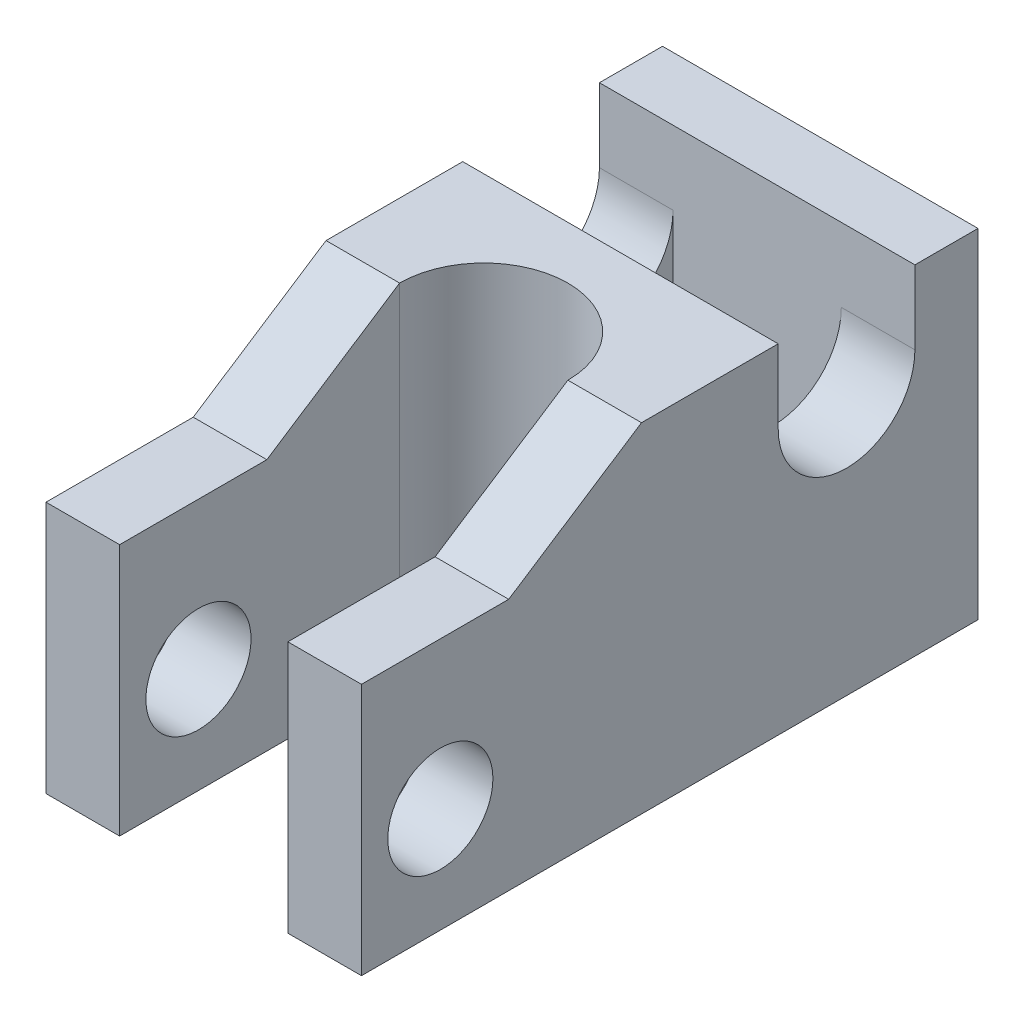
ISO-10303-21;
HEADER;
FILE_DESCRIPTION(('STEP AP214'),'2;1');
FILE_NAME('part.step','',(''),(''),'','','');
FILE_SCHEMA(('AUTOMOTIVE_DESIGN { 1 0 10303 214 1 1 1 1 }'));
ENDSEC;
DATA;
#1=APPLICATION_CONTEXT('core data for automotive mechanical design processes');
#2=APPLICATION_PROTOCOL_DEFINITION('international standard','automotive_design',2000,#1);
#3=PRODUCT_CONTEXT('',#1,'mechanical');
#4=PRODUCT('Part','Part','',(#3));
#5=PRODUCT_RELATED_PRODUCT_CATEGORY('part','',(#4));
#6=PRODUCT_DEFINITION_FORMATION('','',#4);
#7=PRODUCT_DEFINITION_CONTEXT('part definition',#1,'design');
#8=PRODUCT_DEFINITION('design','',#6,#7);
#9=PRODUCT_DEFINITION_SHAPE('','',#8);
#10=(LENGTH_UNIT() NAMED_UNIT(*) SI_UNIT(.MILLI.,.METRE.));
#11=(NAMED_UNIT(*) PLANE_ANGLE_UNIT() SI_UNIT($,.RADIAN.));
#12=(NAMED_UNIT(*) SI_UNIT($,.STERADIAN.) SOLID_ANGLE_UNIT());
#13=UNCERTAINTY_MEASURE_WITH_UNIT(LENGTH_MEASURE(1.E-05),#10,'distance_accuracy_value','');
#14=(GEOMETRIC_REPRESENTATION_CONTEXT(3) GLOBAL_UNCERTAINTY_ASSIGNED_CONTEXT((#13)) GLOBAL_UNIT_ASSIGNED_CONTEXT((#10,
#11,#12)) REPRESENTATION_CONTEXT('',''));
#15=CARTESIAN_POINT('',(0.,0.,0.));
#16=DIRECTION('',(0.,0.,1.));
#17=DIRECTION('',(1.,0.,0.));
#18=AXIS2_PLACEMENT_3D('',#15,#16,#17);
#19=CARTESIAN_POINT('',(0.,0.460908484619424,0.));
#20=DIRECTION('',(0.,1.,0.));
#21=DIRECTION('',(0.,0.,1.));
#22=AXIS2_PLACEMENT_3D('',#19,#20,#21);
#23=PLANE('',#22);
#24=DIRECTION('',(0.,0.,1.));
#25=VECTOR('',#24,1.);
#26=CARTESIAN_POINT('',(-46.,0.460908484619424,0.));
#27=LINE('',#26,#25);
#28=CARTESIAN_POINT('',(-46.,0.460908484619414,-17.8776728376176));
#29=VERTEX_POINT('',#28);
#30=CARTESIAN_POINT('',(-46.,0.460908484619424,8.12232716238245));
#31=VERTEX_POINT('',#30);
#32=EDGE_CURVE('E287',#29,#31,#27,.T.);
#33=ORIENTED_EDGE('',*,*,#32,.F.);
#34=DIRECTION('',(1.,0.,0.));
#35=VECTOR('',#34,1.);
#36=CARTESIAN_POINT('',(0.,0.46090848461941,-17.8776728376176));
#37=LINE('',#36,#35);
#38=CARTESIAN_POINT('',(-14.,0.460908484619414,-17.8776728376176));
#39=VERTEX_POINT('',#38);
#40=EDGE_CURVE('E306',#29,#39,#37,.T.);
#41=ORIENTED_EDGE('',*,*,#40,.T.);
#42=DIRECTION('',(0.,0.,1.));
#43=VECTOR('',#42,1.);
#44=CARTESIAN_POINT('',(-14.,0.460908484619424,0.));
#45=LINE('',#44,#43);
#46=CARTESIAN_POINT('',(-14.,0.460908484619424,8.12232716238245));
#47=VERTEX_POINT('',#46);
#48=EDGE_CURVE('E323',#39,#47,#45,.T.);
#49=ORIENTED_EDGE('',*,*,#48,.T.);
#50=CARTESIAN_POINT('',(-30.,0.460908484619424,8.12232716238245));
#51=DIRECTION('',(0.,1.,0.));
#52=DIRECTION('',(0.,0.,1.));
#53=AXIS2_PLACEMENT_3D('',#50,#51,#52);
#54=CIRCLE('',#53,16.);
#55=EDGE_CURVE('E308',#31,#47,#54,.F.);
#56=ORIENTED_EDGE('',*,*,#55,.F.);
#57=EDGE_LOOP('',(#33,#41,#49,#56));
#58=FACE_BOUND('',#57,.T.);
#59=ADVANCED_FACE('F75',(#58),#23,.F.);
#60=CARTESIAN_POINT('',(-14.,0.,0.));
#61=DIRECTION('',(1.,0.,0.));
#62=DIRECTION('',(0.,0.,-1.));
#63=AXIS2_PLACEMENT_3D('',#60,#61,#62);
#64=PLANE('',#63);
#65=CARTESIAN_POINT('',(-14.,20.,46.3819985638976));
#66=DIRECTION('',(1.,0.,0.));
#67=DIRECTION('',(0.,0.,-1.));
#68=AXIS2_PLACEMENT_3D('',#65,#66,#67);
#69=CIRCLE('',#68,10.);
#70=CARTESIAN_POINT('',(-14.,20.,36.3819985638976));
#71=VERTEX_POINT('',#70);
#72=EDGE_CURVE('E333',#71,#71,#69,.T.);
#73=ORIENTED_EDGE('',*,*,#72,.T.);
#74=EDGE_LOOP('',(#73));
#75=FACE_BOUND('',#74,.T.);
#76=CARTESIAN_POINT('',(-14.,50.4609084846194,-30.8776728376176));
#77=DIRECTION('',(1.,0.,0.));
#78=DIRECTION('',(0.,0.,-1.));
#79=AXIS2_PLACEMENT_3D('',#76,#77,#78);
#80=CIRCLE('',#79,13.);
#81=CARTESIAN_POINT('',(-14.,50.4609084846194,-17.8776728376176));
#82=VERTEX_POINT('',#81);
#83=CARTESIAN_POINT('',(-14.,50.4609084846194,-43.8776728376176));
#84=VERTEX_POINT('',#83);
#85=EDGE_CURVE('E336',#82,#84,#80,.T.);
#86=ORIENTED_EDGE('',*,*,#85,.T.);
#87=DIRECTION('',(0.,-1.,0.));
#88=VECTOR('',#87,1.);
#89=CARTESIAN_POINT('',(-14.,0.,-43.8776728376176));
#90=LINE('',#89,#88);
#91=CARTESIAN_POINT('',(-14.,0.46090848461941,-43.8776728376176));
#92=VERTEX_POINT('',#91);
#93=EDGE_CURVE('E92',#84,#92,#90,.T.);
#94=ORIENTED_EDGE('',*,*,#93,.T.);
#95=DIRECTION('',(0.,0.,-1.));
#96=VECTOR('',#95,1.);
#97=CARTESIAN_POINT('',(-14.,0.46090848461941,0.));
#98=LINE('',#97,#96);
#99=CARTESIAN_POINT('',(-14.,0.46090848461941,-55.8776728376176));
#100=VERTEX_POINT('',#99);
#101=EDGE_CURVE('E96',#92,#100,#98,.T.);
#102=ORIENTED_EDGE('',*,*,#101,.T.);
#103=DIRECTION('',(0.,-1.,0.));
#104=VECTOR('',#103,1.);
#105=CARTESIAN_POINT('',(-14.,0.,-55.8776728376176));
#106=LINE('',#105,#104);
#107=CARTESIAN_POINT('',(-14.,0.,-55.8776728376176));
#108=VERTEX_POINT('',#107);
#109=EDGE_CURVE('E348',#100,#108,#106,.T.);
#110=ORIENTED_EDGE('',*,*,#109,.T.);
#111=DIRECTION('',(0.,0.,-1.));
#112=VECTOR('',#111,1.);
#113=CARTESIAN_POINT('',(-14.,0.,0.));
#114=LINE('',#113,#112);
#115=CARTESIAN_POINT('',(-14.,0.,61.3819985638976));
#116=VERTEX_POINT('',#115);
#117=EDGE_CURVE('E345',#116,#108,#114,.T.);
#118=ORIENTED_EDGE('',*,*,#117,.F.);
#119=DIRECTION('',(0.,1.,0.));
#120=VECTOR('',#119,1.);
#121=CARTESIAN_POINT('',(-14.,0.,61.3819985638976));
#122=LINE('',#121,#120);
#123=CARTESIAN_POINT('',(-14.,48.,61.3819985638976));
#124=VERTEX_POINT('',#123);
#125=EDGE_CURVE('E343',#116,#124,#122,.T.);
#126=ORIENTED_EDGE('',*,*,#125,.T.);
#127=DIRECTION('',(0.,0.,-1.));
#128=VECTOR('',#127,1.);
#129=CARTESIAN_POINT('',(-14.,48.,0.));
#130=LINE('',#129,#128);
#131=CARTESIAN_POINT('',(-14.,48.,33.3819985638976));
#132=VERTEX_POINT('',#131);
#133=EDGE_CURVE('E341',#124,#132,#130,.T.);
#134=ORIENTED_EDGE('',*,*,#133,.T.);
#135=DIRECTION('',(0.,0.545970114749841,-0.837804651335886));
#136=VECTOR('',#135,1.);
#137=CARTESIAN_POINT('',(-14.,48.9614687464449,31.9066009805433));
#138=LINE('',#137,#136);
#139=CARTESIAN_POINT('',(-14.,64.4609084846195,8.12232716238241));
#140=VERTEX_POINT('',#139);
#141=EDGE_CURVE('E339',#132,#140,#138,.T.);
#142=ORIENTED_EDGE('',*,*,#141,.T.);
#143=DIRECTION('',(0.,1.,0.));
#144=VECTOR('',#143,1.);
#145=CARTESIAN_POINT('',(-14.,0.460908484619424,8.12232716238245));
#146=LINE('',#145,#144);
#147=EDGE_CURVE('E320',#47,#140,#146,.T.);
#148=ORIENTED_EDGE('',*,*,#147,.F.);
#149=ORIENTED_EDGE('',*,*,#48,.F.);
#150=DIRECTION('',(0.,-1.,0.));
#151=VECTOR('',#150,1.);
#152=CARTESIAN_POINT('',(-14.,0.,-17.8776728376176));
#153=LINE('',#152,#151);
#154=EDGE_CURVE('E329',#82,#39,#153,.T.);
#155=ORIENTED_EDGE('',*,*,#154,.F.);
#156=EDGE_LOOP('',(#86,#94,#102,#110,#118,#126,#134,#142,#148,#149,#155));
#157=FACE_BOUND('',#156,.T.);
#158=ADVANCED_FACE('F452',(#75,#157),#64,.F.);
#159=CARTESIAN_POINT('',(-14.,50.4609084846194,-30.8776728376176));
#160=DIRECTION('',(1.,0.,0.));
#161=DIRECTION('',(0.,0.,-1.));
#162=AXIS2_PLACEMENT_3D('',#159,#160,#161);
#163=CYLINDRICAL_SURFACE('',#162,13.);
#164=CARTESIAN_POINT('',(0.,50.4609084846194,-30.8776728376176));
#165=DIRECTION('',(1.,0.,0.));
#166=DIRECTION('',(0.,0.,-1.));
#167=AXIS2_PLACEMENT_3D('',#164,#165,#166);
#168=CIRCLE('',#167,13.);
#169=CARTESIAN_POINT('',(0.,50.4609084846194,-17.8776728376176));
#170=VERTEX_POINT('',#169);
#171=CARTESIAN_POINT('',(0.,50.4609084846194,-43.8776728376176));
#172=VERTEX_POINT('',#171);
#173=EDGE_CURVE('E352',#170,#172,#168,.T.);
#174=ORIENTED_EDGE('',*,*,#173,.T.);
#175=DIRECTION('',(1.,0.,0.));
#176=VECTOR('',#175,1.);
#177=CARTESIAN_POINT('',(-14.,50.4609084846194,-43.8776728376176));
#178=LINE('',#177,#176);
#179=EDGE_CURVE('E12',#84,#172,#178,.T.);
#180=ORIENTED_EDGE('',*,*,#179,.F.);
#181=ORIENTED_EDGE('',*,*,#85,.F.);
#182=DIRECTION('',(1.,0.,0.));
#183=VECTOR('',#182,1.);
#184=CARTESIAN_POINT('',(-14.,50.4609084846194,-17.8776728376176));
#185=LINE('',#184,#183);
#186=EDGE_CURVE('E79',#82,#170,#185,.T.);
#187=ORIENTED_EDGE('',*,*,#186,.T.);
#188=EDGE_LOOP('',(#174,#180,#181,#187));
#189=FACE_BOUND('',#188,.T.);
#190=ADVANCED_FACE('F400',(#189),#163,.F.);
#191=CARTESIAN_POINT('',(-14.,0.,-43.8776728376176));
#192=DIRECTION('',(0.,0.,1.));
#193=DIRECTION('',(1.,0.,0.));
#194=AXIS2_PLACEMENT_3D('',#191,#192,#193);
#195=PLANE('',#194);
#196=DIRECTION('',(0.,-1.,0.));
#197=VECTOR('',#196,1.);
#198=CARTESIAN_POINT('',(0.,0.,-43.8776728376176));
#199=LINE('',#198,#197);
#200=CARTESIAN_POINT('',(0.,64.4609084846194,-43.8776728376176));
#201=VERTEX_POINT('',#200);
#202=EDGE_CURVE('E337',#201,#172,#199,.T.);
#203=ORIENTED_EDGE('',*,*,#202,.F.);
#204=DIRECTION('',(1.,0.,0.));
#205=VECTOR('',#204,1.);
#206=CARTESIAN_POINT('',(-14.,64.4609084846194,-43.8776728376176));
#207=LINE('',#206,#205);
#208=CARTESIAN_POINT('',(-60.,64.4609084846194,-43.8776728376176));
#209=VERTEX_POINT('',#208);
#210=EDGE_CURVE('E84',#209,#201,#207,.T.);
#211=ORIENTED_EDGE('',*,*,#210,.F.);
#212=DIRECTION('',(0.,-1.,0.));
#213=VECTOR('',#212,1.);
#214=CARTESIAN_POINT('',(-60.,0.,-43.8776728376176));
#215=LINE('',#214,#213);
#216=CARTESIAN_POINT('',(-60.,50.4609084846194,-43.8776728376176));
#217=VERTEX_POINT('',#216);
#218=EDGE_CURVE('E249',#209,#217,#215,.T.);
#219=ORIENTED_EDGE('',*,*,#218,.T.);
#220=DIRECTION('',(-1.,0.,0.));
#221=VECTOR('',#220,1.);
#222=CARTESIAN_POINT('',(-46.,50.4609084846194,-43.8776728376176));
#223=LINE('',#222,#221);
#224=CARTESIAN_POINT('',(-46.,50.4609084846194,-43.8776728376176));
#225=VERTEX_POINT('',#224);
#226=EDGE_CURVE('E223',#225,#217,#223,.T.);
#227=ORIENTED_EDGE('',*,*,#226,.F.);
#228=DIRECTION('',(0.,1.,0.));
#229=VECTOR('',#228,1.);
#230=CARTESIAN_POINT('',(-46.,0.,-43.8776728376176));
#231=LINE('',#230,#229);
#232=CARTESIAN_POINT('',(-46.,0.46090848461941,-43.8776728376176));
#233=VERTEX_POINT('',#232);
#234=EDGE_CURVE('E217',#233,#225,#231,.T.);
#235=ORIENTED_EDGE('',*,*,#234,.F.);
#236=DIRECTION('',(1.,0.,0.));
#237=VECTOR('',#236,1.);
#238=CARTESIAN_POINT('',(0.,0.46090848461941,-43.8776728376176));
#239=LINE('',#238,#237);
#240=EDGE_CURVE('E221',#233,#92,#239,.T.);
#241=ORIENTED_EDGE('',*,*,#240,.T.);
#242=ORIENTED_EDGE('',*,*,#93,.F.);
#243=ORIENTED_EDGE('',*,*,#179,.T.);
#244=EDGE_LOOP('',(#203,#211,#219,#227,#235,#241,#242,#243));
#245=FACE_BOUND('',#244,.T.);
#246=ADVANCED_FACE('F220',(#245),#195,.T.);
#247=CARTESIAN_POINT('',(-14.,64.4609084846194,0.));
#248=DIRECTION('',(0.,-1.,0.));
#249=DIRECTION('',(0.,0.,-1.));
#250=AXIS2_PLACEMENT_3D('',#247,#248,#249);
#251=PLANE('',#250);
#252=DIRECTION('',(0.,0.,-1.));
#253=VECTOR('',#252,1.);
#254=CARTESIAN_POINT('',(0.,64.4609084846194,0.));
#255=LINE('',#254,#253);
#256=CARTESIAN_POINT('',(0.,64.4609084846194,-55.8776728376176));
#257=VERTEX_POINT('',#256);
#258=EDGE_CURVE('E371',#201,#257,#255,.T.);
#259=ORIENTED_EDGE('',*,*,#258,.T.);
#260=DIRECTION('',(1.,0.,0.));
#261=VECTOR('',#260,1.);
#262=CARTESIAN_POINT('',(-14.,64.4609084846194,-55.8776728376176));
#263=LINE('',#262,#261);
#264=CARTESIAN_POINT('',(-60.,64.4609084846194,-55.8776728376176));
#265=VERTEX_POINT('',#264);
#266=EDGE_CURVE('E376',#265,#257,#263,.T.);
#267=ORIENTED_EDGE('',*,*,#266,.F.);
#268=DIRECTION('',(0.,0.,-1.));
#269=VECTOR('',#268,1.);
#270=CARTESIAN_POINT('',(-60.,64.4609084846194,0.));
#271=LINE('',#270,#269);
#272=EDGE_CURVE('E282',#209,#265,#271,.T.);
#273=ORIENTED_EDGE('',*,*,#272,.F.);
#274=ORIENTED_EDGE('',*,*,#210,.T.);
#275=EDGE_LOOP('',(#259,#267,#273,#274));
#276=FACE_BOUND('',#275,.T.);
#277=ADVANCED_FACE('F412',(#276),#251,.F.);
#278=CARTESIAN_POINT('',(-14.,0.,-55.8776728376176));
#279=DIRECTION('',(0.,0.,1.));
#280=DIRECTION('',(0.,-1.,0.));
#281=AXIS2_PLACEMENT_3D('',#278,#279,#280);
#282=PLANE('',#281);
#283=ORIENTED_EDGE('',*,*,#109,.F.);
#284=DIRECTION('',(-1.,0.,0.));
#285=VECTOR('',#284,1.);
#286=CARTESIAN_POINT('',(-60.,0.46090848461941,-55.8776728376176));
#287=LINE('',#286,#285);
#288=CARTESIAN_POINT('',(-46.,0.46090848461941,-55.8776728376176));
#289=VERTEX_POINT('',#288);
#290=EDGE_CURVE('E233',#100,#289,#287,.T.);
#291=ORIENTED_EDGE('',*,*,#290,.T.);
#292=DIRECTION('',(0.,-1.,0.));
#293=VECTOR('',#292,1.);
#294=CARTESIAN_POINT('',(-46.,0.,-55.8776728376176));
#295=LINE('',#294,#293);
#296=CARTESIAN_POINT('',(-46.,0.,-55.8776728376176));
#297=VERTEX_POINT('',#296);
#298=EDGE_CURVE('E238',#289,#297,#295,.T.);
#299=ORIENTED_EDGE('',*,*,#298,.T.);
#300=DIRECTION('',(-1.,0.,0.));
#301=VECTOR('',#300,1.);
#302=CARTESIAN_POINT('',(-46.,0.,-55.8776728376176));
#303=LINE('',#302,#301);
#304=CARTESIAN_POINT('',(-60.,0.,-55.8776728376176));
#305=VERTEX_POINT('',#304);
#306=EDGE_CURVE('E288',#297,#305,#303,.T.);
#307=ORIENTED_EDGE('',*,*,#306,.T.);
#308=DIRECTION('',(0.,-1.,0.));
#309=VECTOR('',#308,1.);
#310=CARTESIAN_POINT('',(-60.,0.,-55.8776728376176));
#311=LINE('',#310,#309);
#312=EDGE_CURVE('E280',#265,#305,#311,.T.);
#313=ORIENTED_EDGE('',*,*,#312,.F.);
#314=ORIENTED_EDGE('',*,*,#266,.T.);
#315=DIRECTION('',(0.,-1.,0.));
#316=VECTOR('',#315,1.);
#317=CARTESIAN_POINT('',(0.,0.,-55.8776728376176));
#318=LINE('',#317,#316);
#319=CARTESIAN_POINT('',(0.,0.,-55.8776728376176));
#320=VERTEX_POINT('',#319);
#321=EDGE_CURVE('E369',#257,#320,#318,.T.);
#322=ORIENTED_EDGE('',*,*,#321,.T.);
#323=DIRECTION('',(1.,0.,0.));
#324=VECTOR('',#323,1.);
#325=CARTESIAN_POINT('',(-14.,0.,-55.8776728376176));
#326=LINE('',#325,#324);
#327=EDGE_CURVE('E379',#108,#320,#326,.T.);
#328=ORIENTED_EDGE('',*,*,#327,.F.);
#329=EDGE_LOOP('',(#283,#291,#299,#307,#313,#314,#322,#328));
#330=FACE_BOUND('',#329,.T.);
#331=ADVANCED_FACE('F449',(#330),#282,.F.);
#332=CARTESIAN_POINT('',(-14.,0.,0.));
#333=DIRECTION('',(0.,-1.,0.));
#334=DIRECTION('',(0.,0.,-1.));
#335=AXIS2_PLACEMENT_3D('',#332,#333,#334);
#336=PLANE('',#335);
#337=DIRECTION('',(0.,0.,-1.));
#338=VECTOR('',#337,1.);
#339=CARTESIAN_POINT('',(0.,0.,0.));
#340=LINE('',#339,#338);
#341=CARTESIAN_POINT('',(0.,0.,61.3819985638976));
#342=VERTEX_POINT('',#341);
#343=EDGE_CURVE('E366',#342,#320,#340,.T.);
#344=ORIENTED_EDGE('',*,*,#343,.F.);
#345=DIRECTION('',(1.,0.,0.));
#346=VECTOR('',#345,1.);
#347=CARTESIAN_POINT('',(-14.,0.,61.3819985638976));
#348=LINE('',#347,#346);
#349=EDGE_CURVE('E382',#116,#342,#348,.T.);
#350=ORIENTED_EDGE('',*,*,#349,.F.);
#351=ORIENTED_EDGE('',*,*,#117,.T.);
#352=ORIENTED_EDGE('',*,*,#327,.T.);
#353=EDGE_LOOP('',(#344,#350,#351,#352));
#354=FACE_BOUND('',#353,.T.);
#355=ADVANCED_FACE('F457',(#354),#336,.T.);
#356=CARTESIAN_POINT('',(-14.,0.,61.3819985638976));
#357=DIRECTION('',(0.,0.,-1.));
#358=DIRECTION('',(-1.,0.,0.));
#359=AXIS2_PLACEMENT_3D('',#356,#357,#358);
#360=PLANE('',#359);
#361=DIRECTION('',(0.,1.,0.));
#362=VECTOR('',#361,1.);
#363=CARTESIAN_POINT('',(0.,0.,61.3819985638976));
#364=LINE('',#363,#362);
#365=CARTESIAN_POINT('',(0.,48.,61.3819985638976));
#366=VERTEX_POINT('',#365);
#367=EDGE_CURVE('E364',#342,#366,#364,.T.);
#368=ORIENTED_EDGE('',*,*,#367,.T.);
#369=DIRECTION('',(1.,0.,0.));
#370=VECTOR('',#369,1.);
#371=CARTESIAN_POINT('',(-14.,48.,61.3819985638976));
#372=LINE('',#371,#370);
#373=EDGE_CURVE('E384',#124,#366,#372,.T.);
#374=ORIENTED_EDGE('',*,*,#373,.F.);
#375=ORIENTED_EDGE('',*,*,#125,.F.);
#376=ORIENTED_EDGE('',*,*,#349,.T.);
#377=EDGE_LOOP('',(#368,#374,#375,#376));
#378=FACE_BOUND('',#377,.T.);
#379=ADVANCED_FACE('F460',(#378),#360,.F.);
#380=CARTESIAN_POINT('',(-14.,48.,0.));
#381=DIRECTION('',(0.,-1.,0.));
#382=DIRECTION('',(0.,0.,-1.));
#383=AXIS2_PLACEMENT_3D('',#380,#381,#382);
#384=PLANE('',#383);
#385=DIRECTION('',(0.,0.,-1.));
#386=VECTOR('',#385,1.);
#387=CARTESIAN_POINT('',(0.,48.,0.));
#388=LINE('',#387,#386);
#389=CARTESIAN_POINT('',(0.,48.,33.3819985638976));
#390=VERTEX_POINT('',#389);
#391=EDGE_CURVE('E362',#366,#390,#388,.T.);
#392=ORIENTED_EDGE('',*,*,#391,.T.);
#393=DIRECTION('',(1.,0.,0.));
#394=VECTOR('',#393,1.);
#395=CARTESIAN_POINT('',(-14.,48.,33.3819985638976));
#396=LINE('',#395,#394);
#397=EDGE_CURVE('E387',#132,#390,#396,.T.);
#398=ORIENTED_EDGE('',*,*,#397,.F.);
#399=ORIENTED_EDGE('',*,*,#133,.F.);
#400=ORIENTED_EDGE('',*,*,#373,.T.);
#401=EDGE_LOOP('',(#392,#398,#399,#400));
#402=FACE_BOUND('',#401,.T.);
#403=ADVANCED_FACE('F465',(#402),#384,.F.);
#404=CARTESIAN_POINT('',(-14.,48.9614687464449,31.9066009805433));
#405=DIRECTION('',(0.,-0.837804651335886,-0.545970114749841));
#406=DIRECTION('',(0.,0.545970114749841,-0.837804651335886));
#407=AXIS2_PLACEMENT_3D('',#404,#405,#406);
#408=PLANE('',#407);
#409=DIRECTION('',(0.,0.545970114749841,-0.837804651335886));
#410=VECTOR('',#409,1.);
#411=CARTESIAN_POINT('',(0.,48.9614687464449,31.9066009805433));
#412=LINE('',#411,#410);
#413=CARTESIAN_POINT('',(0.,64.4609084846195,8.12232716238241));
#414=VERTEX_POINT('',#413);
#415=EDGE_CURVE('E360',#390,#414,#412,.T.);
#416=ORIENTED_EDGE('',*,*,#415,.T.);
#417=DIRECTION('',(1.,0.,0.));
#418=VECTOR('',#417,1.);
#419=CARTESIAN_POINT('',(-14.,64.4609084846195,8.12232716238241));
#420=LINE('',#419,#418);
#421=EDGE_CURVE('E390',#140,#414,#420,.T.);
#422=ORIENTED_EDGE('',*,*,#421,.F.);
#423=ORIENTED_EDGE('',*,*,#141,.F.);
#424=ORIENTED_EDGE('',*,*,#397,.T.);
#425=EDGE_LOOP('',(#416,#422,#423,#424));
#426=FACE_BOUND('',#425,.T.);
#427=ADVANCED_FACE('F469',(#426),#408,.F.);
#428=CARTESIAN_POINT('',(-14.,64.4609084846195,0.));
#429=DIRECTION('',(0.,-1.,0.));
#430=DIRECTION('',(0.,0.,-1.));
#431=AXIS2_PLACEMENT_3D('',#428,#429,#430);
#432=PLANE('',#431);
#433=DIRECTION('',(1.,0.,0.));
#434=VECTOR('',#433,1.);
#435=CARTESIAN_POINT('',(0.,64.4609084846195,8.12232716238241));
#436=LINE('',#435,#434);
#437=CARTESIAN_POINT('',(-60.,64.4609084846195,8.12232716238241));
#438=VERTEX_POINT('',#437);
#439=CARTESIAN_POINT('',(-46.,64.4609084846195,8.12232716238241));
#440=VERTEX_POINT('',#439);
#441=EDGE_CURVE('E315',#438,#440,#436,.T.);
#442=ORIENTED_EDGE('',*,*,#441,.T.);
#443=CARTESIAN_POINT('',(-30.,64.4609084846195,8.12232716238241));
#444=DIRECTION('',(0.,1.,0.));
#445=DIRECTION('',(0.,0.,1.));
#446=AXIS2_PLACEMENT_3D('',#443,#444,#445);
#447=CIRCLE('',#446,16.);
#448=EDGE_CURVE('E309',#440,#140,#447,.F.);
#449=ORIENTED_EDGE('',*,*,#448,.T.);
#450=ORIENTED_EDGE('',*,*,#421,.T.);
#451=DIRECTION('',(0.,0.,-1.));
#452=VECTOR('',#451,1.);
#453=CARTESIAN_POINT('',(0.,64.4609084846195,0.));
#454=LINE('',#453,#452);
#455=CARTESIAN_POINT('',(0.,64.4609084846194,-17.8776728376176));
#456=VERTEX_POINT('',#455);
#457=EDGE_CURVE('E357',#414,#456,#454,.T.);
#458=ORIENTED_EDGE('',*,*,#457,.T.);
#459=DIRECTION('',(1.,0.,0.));
#460=VECTOR('',#459,1.);
#461=CARTESIAN_POINT('',(-14.,64.4609084846194,-17.8776728376176));
#462=LINE('',#461,#460);
#463=CARTESIAN_POINT('',(-60.,64.4609084846194,-17.8776728376176));
#464=VERTEX_POINT('',#463);
#465=EDGE_CURVE('E392',#464,#456,#462,.T.);
#466=ORIENTED_EDGE('',*,*,#465,.F.);
#467=DIRECTION('',(0.,0.,1.));
#468=VECTOR('',#467,1.);
#469=CARTESIAN_POINT('',(-60.,64.4609084846195,0.));
#470=LINE('',#469,#468);
#471=EDGE_CURVE('E305',#464,#438,#470,.T.);
#472=ORIENTED_EDGE('',*,*,#471,.T.);
#473=EDGE_LOOP('',(#442,#449,#450,#458,#466,#472));
#474=FACE_BOUND('',#473,.T.);
#475=ADVANCED_FACE('F472',(#474),#432,.F.);
#476=CARTESIAN_POINT('',(-14.,20.,46.3819985638976));
#477=DIRECTION('',(1.,0.,0.));
#478=DIRECTION('',(0.,0.,-1.));
#479=AXIS2_PLACEMENT_3D('',#476,#477,#478);
#480=CYLINDRICAL_SURFACE('',#479,10.);
#481=ORIENTED_EDGE('',*,*,#72,.F.);
#482=EDGE_LOOP('',(#481));
#483=FACE_BOUND('',#482,.T.);
#484=CARTESIAN_POINT('',(0.,20.,46.3819985638976));
#485=DIRECTION('',(1.,0.,0.));
#486=DIRECTION('',(0.,0.,-1.));
#487=AXIS2_PLACEMENT_3D('',#484,#485,#486);
#488=CIRCLE('',#487,10.);
#489=CARTESIAN_POINT('',(0.,20.,36.3819985638976));
#490=VERTEX_POINT('',#489);
#491=EDGE_CURVE('E332',#490,#490,#488,.T.);
#492=ORIENTED_EDGE('',*,*,#491,.T.);
#493=EDGE_LOOP('',(#492));
#494=FACE_BOUND('',#493,.T.);
#495=ADVANCED_FACE('F77',(#483,#494),#480,.F.);
#496=CARTESIAN_POINT('',(-14.,0.,-17.8776728376176));
#497=DIRECTION('',(0.,0.,1.));
#498=DIRECTION('',(0.,-1.,0.));
#499=AXIS2_PLACEMENT_3D('',#496,#497,#498);
#500=PLANE('',#499);
#501=ORIENTED_EDGE('',*,*,#465,.T.);
#502=DIRECTION('',(0.,-1.,0.));
#503=VECTOR('',#502,1.);
#504=CARTESIAN_POINT('',(0.,0.,-17.8776728376176));
#505=LINE('',#504,#503);
#506=EDGE_CURVE('E355',#456,#170,#505,.T.);
#507=ORIENTED_EDGE('',*,*,#506,.T.);
#508=ORIENTED_EDGE('',*,*,#186,.F.);
#509=ORIENTED_EDGE('',*,*,#154,.T.);
#510=ORIENTED_EDGE('',*,*,#40,.F.);
#511=DIRECTION('',(0.,-1.,0.));
#512=VECTOR('',#511,1.);
#513=CARTESIAN_POINT('',(-46.,0.,-17.8776728376176));
#514=LINE('',#513,#512);
#515=CARTESIAN_POINT('',(-46.,50.4609084846194,-17.8776728376176));
#516=VERTEX_POINT('',#515);
#517=EDGE_CURVE('E303',#516,#29,#514,.T.);
#518=ORIENTED_EDGE('',*,*,#517,.F.);
#519=DIRECTION('',(-1.,0.,0.));
#520=VECTOR('',#519,1.);
#521=CARTESIAN_POINT('',(-46.,50.4609084846194,-17.8776728376176));
#522=LINE('',#521,#520);
#523=CARTESIAN_POINT('',(-60.,50.4609084846194,-17.8776728376176));
#524=VERTEX_POINT('',#523);
#525=EDGE_CURVE('E263',#516,#524,#522,.T.);
#526=ORIENTED_EDGE('',*,*,#525,.T.);
#527=DIRECTION('',(0.,1.,0.));
#528=VECTOR('',#527,1.);
#529=CARTESIAN_POINT('',(-60.,0.46090848461941,-17.8776728376176));
#530=LINE('',#529,#528);
#531=EDGE_CURVE('E312',#524,#464,#530,.T.);
#532=ORIENTED_EDGE('',*,*,#531,.T.);
#533=EDGE_LOOP('',(#501,#507,#508,#509,#510,#518,#526,#532));
#534=FACE_BOUND('',#533,.T.);
#535=ADVANCED_FACE('F423',(#534),#500,.F.);
#536=CARTESIAN_POINT('',(0.,0.,0.));
#537=DIRECTION('',(1.,0.,0.));
#538=DIRECTION('',(0.,0.,-1.));
#539=AXIS2_PLACEMENT_3D('',#536,#537,#538);
#540=PLANE('',#539);
#541=ORIENTED_EDGE('',*,*,#202,.T.);
#542=ORIENTED_EDGE('',*,*,#173,.F.);
#543=ORIENTED_EDGE('',*,*,#506,.F.);
#544=ORIENTED_EDGE('',*,*,#457,.F.);
#545=ORIENTED_EDGE('',*,*,#415,.F.);
#546=ORIENTED_EDGE('',*,*,#391,.F.);
#547=ORIENTED_EDGE('',*,*,#367,.F.);
#548=ORIENTED_EDGE('',*,*,#343,.T.);
#549=ORIENTED_EDGE('',*,*,#321,.F.);
#550=ORIENTED_EDGE('',*,*,#258,.F.);
#551=EDGE_LOOP('',(#541,#542,#543,#544,#545,#546,#547,#548,#549,#550));
#552=FACE_BOUND('',#551,.T.);
#553=ORIENTED_EDGE('',*,*,#491,.F.);
#554=EDGE_LOOP('',(#553));
#555=FACE_BOUND('',#554,.T.);
#556=ADVANCED_FACE('F404',(#552,#555),#540,.T.);
#557=CARTESIAN_POINT('',(-30.,0.460908484619424,8.12232716238245));
#558=DIRECTION('',(0.,1.,0.));
#559=DIRECTION('',(0.,0.,1.));
#560=AXIS2_PLACEMENT_3D('',#557,#558,#559);
#561=CYLINDRICAL_SURFACE('',#560,16.);
#562=ORIENTED_EDGE('',*,*,#448,.F.);
#563=DIRECTION('',(0.,1.,0.));
#564=VECTOR('',#563,1.);
#565=CARTESIAN_POINT('',(-46.,0.460908484619424,8.12232716238245));
#566=LINE('',#565,#564);
#567=EDGE_CURVE('E324',#31,#440,#566,.T.);
#568=ORIENTED_EDGE('',*,*,#567,.F.);
#569=ORIENTED_EDGE('',*,*,#55,.T.);
#570=ORIENTED_EDGE('',*,*,#147,.T.);
#571=EDGE_LOOP('',(#562,#568,#569,#570));
#572=FACE_BOUND('',#571,.T.);
#573=ADVANCED_FACE('F432',(#572),#561,.F.);
#574=CARTESIAN_POINT('',(-60.,0.460908484619424,0.));
#575=DIRECTION('',(-1.,0.,0.));
#576=DIRECTION('',(0.,0.,1.));
#577=AXIS2_PLACEMENT_3D('',#574,#575,#576);
#578=PLANE('',#577);
#579=CARTESIAN_POINT('',(-60.,50.4609084846194,-30.8776728376176));
#580=DIRECTION('',(1.,0.,0.));
#581=DIRECTION('',(0.,0.,-1.));
#582=AXIS2_PLACEMENT_3D('',#579,#580,#581);
#583=CIRCLE('',#582,13.);
#584=EDGE_CURVE('E266',#524,#217,#583,.T.);
#585=ORIENTED_EDGE('',*,*,#584,.T.);
#586=ORIENTED_EDGE('',*,*,#218,.F.);
#587=ORIENTED_EDGE('',*,*,#272,.T.);
#588=ORIENTED_EDGE('',*,*,#312,.T.);
#589=DIRECTION('',(0.,0.,-1.));
#590=VECTOR('',#589,1.);
#591=CARTESIAN_POINT('',(-60.,0.,0.));
#592=LINE('',#591,#590);
#593=CARTESIAN_POINT('',(-60.,0.,61.3819985638976));
#594=VERTEX_POINT('',#593);
#595=EDGE_CURVE('E277',#594,#305,#592,.T.);
#596=ORIENTED_EDGE('',*,*,#595,.F.);
#597=DIRECTION('',(0.,1.,0.));
#598=VECTOR('',#597,1.);
#599=CARTESIAN_POINT('',(-60.,0.,61.3819985638976));
#600=LINE('',#599,#598);
#601=CARTESIAN_POINT('',(-60.,48.,61.3819985638976));
#602=VERTEX_POINT('',#601);
#603=EDGE_CURVE('E274',#594,#602,#600,.T.);
#604=ORIENTED_EDGE('',*,*,#603,.T.);
#605=DIRECTION('',(0.,0.,-1.));
#606=VECTOR('',#605,1.);
#607=CARTESIAN_POINT('',(-60.,48.,0.));
#608=LINE('',#607,#606);
#609=CARTESIAN_POINT('',(-60.,48.,33.3819985638976));
#610=VERTEX_POINT('',#609);
#611=EDGE_CURVE('E271',#602,#610,#608,.T.);
#612=ORIENTED_EDGE('',*,*,#611,.T.);
#613=DIRECTION('',(0.,0.545970114749841,-0.837804651335886));
#614=VECTOR('',#613,1.);
#615=CARTESIAN_POINT('',(-60.,48.9614687464449,31.9066009805433));
#616=LINE('',#615,#614);
#617=EDGE_CURVE('E269',#610,#438,#616,.T.);
#618=ORIENTED_EDGE('',*,*,#617,.T.);
#619=ORIENTED_EDGE('',*,*,#471,.F.);
#620=ORIENTED_EDGE('',*,*,#531,.F.);
#621=EDGE_LOOP('',(#585,#586,#587,#588,#596,#604,#612,#618,#619,#620));
#622=FACE_BOUND('',#621,.T.);
#623=CARTESIAN_POINT('',(-60.,20.,46.3819985638976));
#624=DIRECTION('',(1.,0.,0.));
#625=DIRECTION('',(0.,0.,-1.));
#626=AXIS2_PLACEMENT_3D('',#623,#624,#625);
#627=CIRCLE('',#626,10.);
#628=CARTESIAN_POINT('',(-60.,20.,36.3819985638976));
#629=VERTEX_POINT('',#628);
#630=EDGE_CURVE('E244',#629,#629,#627,.T.);
#631=ORIENTED_EDGE('',*,*,#630,.T.);
#632=EDGE_LOOP('',(#631));
#633=FACE_BOUND('',#632,.T.);
#634=ADVANCED_FACE('F415',(#622,#633),#578,.T.);
#635=CARTESIAN_POINT('',(-46.,0.,0.));
#636=DIRECTION('',(-1.,0.,0.));
#637=DIRECTION('',(0.,0.,-1.));
#638=AXIS2_PLACEMENT_3D('',#635,#636,#637);
#639=PLANE('',#638);
#640=CARTESIAN_POINT('',(-46.,20.,46.3819985638976));
#641=DIRECTION('',(1.,0.,0.));
#642=DIRECTION('',(0.,0.,-1.));
#643=AXIS2_PLACEMENT_3D('',#640,#641,#642);
#644=CIRCLE('',#643,10.);
#645=CARTESIAN_POINT('',(-46.,20.,36.3819985638976));
#646=VERTEX_POINT('',#645);
#647=EDGE_CURVE('E245',#646,#646,#644,.T.);
#648=ORIENTED_EDGE('',*,*,#647,.F.);
#649=EDGE_LOOP('',(#648));
#650=FACE_BOUND('',#649,.T.);
#651=DIRECTION('',(0.,0.,1.));
#652=VECTOR('',#651,1.);
#653=CARTESIAN_POINT('',(-46.,0.46090848461941,0.));
#654=LINE('',#653,#652);
#655=EDGE_CURVE('E231',#289,#233,#654,.T.);
#656=ORIENTED_EDGE('',*,*,#655,.T.);
#657=ORIENTED_EDGE('',*,*,#234,.T.);
#658=CARTESIAN_POINT('',(-46.,50.4609084846194,-30.8776728376176));
#659=DIRECTION('',(1.,0.,0.));
#660=DIRECTION('',(0.,0.,-1.));
#661=AXIS2_PLACEMENT_3D('',#658,#659,#660);
#662=CIRCLE('',#661,13.);
#663=EDGE_CURVE('E248',#516,#225,#662,.T.);
#664=ORIENTED_EDGE('',*,*,#663,.F.);
#665=ORIENTED_EDGE('',*,*,#517,.T.);
#666=ORIENTED_EDGE('',*,*,#32,.T.);
#667=ORIENTED_EDGE('',*,*,#567,.T.);
#668=DIRECTION('',(0.,0.545970114749841,-0.837804651335886));
#669=VECTOR('',#668,1.);
#670=CARTESIAN_POINT('',(-46.,48.9614687464449,31.9066009805433));
#671=LINE('',#670,#669);
#672=CARTESIAN_POINT('',(-46.,48.,33.3819985638976));
#673=VERTEX_POINT('',#672);
#674=EDGE_CURVE('E251',#673,#440,#671,.T.);
#675=ORIENTED_EDGE('',*,*,#674,.F.);
#676=DIRECTION('',(0.,0.,-1.));
#677=VECTOR('',#676,1.);
#678=CARTESIAN_POINT('',(-46.,48.,0.));
#679=LINE('',#678,#677);
#680=CARTESIAN_POINT('',(-46.,48.,61.3819985638976));
#681=VERTEX_POINT('',#680);
#682=EDGE_CURVE('E254',#681,#673,#679,.T.);
#683=ORIENTED_EDGE('',*,*,#682,.F.);
#684=DIRECTION('',(0.,1.,0.));
#685=VECTOR('',#684,1.);
#686=CARTESIAN_POINT('',(-46.,0.,61.3819985638976));
#687=LINE('',#686,#685);
#688=CARTESIAN_POINT('',(-46.,0.,61.3819985638976));
#689=VERTEX_POINT('',#688);
#690=EDGE_CURVE('E257',#689,#681,#687,.T.);
#691=ORIENTED_EDGE('',*,*,#690,.F.);
#692=DIRECTION('',(0.,0.,-1.));
#693=VECTOR('',#692,1.);
#694=CARTESIAN_POINT('',(-46.,0.,0.));
#695=LINE('',#694,#693);
#696=EDGE_CURVE('E260',#689,#297,#695,.T.);
#697=ORIENTED_EDGE('',*,*,#696,.T.);
#698=ORIENTED_EDGE('',*,*,#298,.F.);
#699=EDGE_LOOP('',(#656,#657,#664,#665,#666,#667,#675,#683,#691,#697,#698));
#700=FACE_BOUND('',#699,.T.);
#701=ADVANCED_FACE('F236',(#650,#700),#639,.F.);
#702=CARTESIAN_POINT('',(-46.,50.4609084846194,-30.8776728376176));
#703=DIRECTION('',(-1.,0.,0.));
#704=DIRECTION('',(0.,0.,-1.));
#705=AXIS2_PLACEMENT_3D('',#702,#703,#704);
#706=CYLINDRICAL_SURFACE('',#705,13.);
#707=ORIENTED_EDGE('',*,*,#584,.F.);
#708=ORIENTED_EDGE('',*,*,#525,.F.);
#709=ORIENTED_EDGE('',*,*,#663,.T.);
#710=ORIENTED_EDGE('',*,*,#226,.T.);
#711=EDGE_LOOP('',(#707,#708,#709,#710));
#712=FACE_BOUND('',#711,.T.);
#713=ADVANCED_FACE('F421',(#712),#706,.F.);
#714=CARTESIAN_POINT('',(-46.,0.,0.));
#715=DIRECTION('',(0.,-1.,0.));
#716=DIRECTION('',(0.,0.,-1.));
#717=AXIS2_PLACEMENT_3D('',#714,#715,#716);
#718=PLANE('',#717);
#719=ORIENTED_EDGE('',*,*,#595,.T.);
#720=ORIENTED_EDGE('',*,*,#306,.F.);
#721=ORIENTED_EDGE('',*,*,#696,.F.);
#722=DIRECTION('',(-1.,0.,0.));
#723=VECTOR('',#722,1.);
#724=CARTESIAN_POINT('',(-46.,0.,61.3819985638976));
#725=LINE('',#724,#723);
#726=EDGE_CURVE('E291',#689,#594,#725,.T.);
#727=ORIENTED_EDGE('',*,*,#726,.T.);
#728=EDGE_LOOP('',(#719,#720,#721,#727));
#729=FACE_BOUND('',#728,.T.);
#730=ADVANCED_FACE('F447',(#729),#718,.T.);
#731=CARTESIAN_POINT('',(-46.,0.,61.3819985638976));
#732=DIRECTION('',(0.,0.,-1.));
#733=DIRECTION('',(1.,0.,0.));
#734=AXIS2_PLACEMENT_3D('',#731,#732,#733);
#735=PLANE('',#734);
#736=ORIENTED_EDGE('',*,*,#603,.F.);
#737=ORIENTED_EDGE('',*,*,#726,.F.);
#738=ORIENTED_EDGE('',*,*,#690,.T.);
#739=DIRECTION('',(-1.,0.,0.));
#740=VECTOR('',#739,1.);
#741=CARTESIAN_POINT('',(-46.,48.,61.3819985638976));
#742=LINE('',#741,#740);
#743=EDGE_CURVE('E294',#681,#602,#742,.T.);
#744=ORIENTED_EDGE('',*,*,#743,.T.);
#745=EDGE_LOOP('',(#736,#737,#738,#744));
#746=FACE_BOUND('',#745,.T.);
#747=ADVANCED_FACE('F444',(#746),#735,.F.);
#748=CARTESIAN_POINT('',(-46.,48.,0.));
#749=DIRECTION('',(0.,-1.,0.));
#750=DIRECTION('',(0.,0.,-1.));
#751=AXIS2_PLACEMENT_3D('',#748,#749,#750);
#752=PLANE('',#751);
#753=ORIENTED_EDGE('',*,*,#611,.F.);
#754=ORIENTED_EDGE('',*,*,#743,.F.);
#755=ORIENTED_EDGE('',*,*,#682,.T.);
#756=DIRECTION('',(-1.,0.,0.));
#757=VECTOR('',#756,1.);
#758=CARTESIAN_POINT('',(-46.,48.,33.3819985638976));
#759=LINE('',#758,#757);
#760=EDGE_CURVE('E297',#673,#610,#759,.T.);
#761=ORIENTED_EDGE('',*,*,#760,.T.);
#762=EDGE_LOOP('',(#753,#754,#755,#761));
#763=FACE_BOUND('',#762,.T.);
#764=ADVANCED_FACE('F439',(#763),#752,.F.);
#765=CARTESIAN_POINT('',(-46.,48.9614687464449,31.9066009805433));
#766=DIRECTION('',(0.,-0.837804651335886,-0.545970114749841));
#767=DIRECTION('',(0.,0.545970114749841,-0.837804651335886));
#768=AXIS2_PLACEMENT_3D('',#765,#766,#767);
#769=PLANE('',#768);
#770=ORIENTED_EDGE('',*,*,#617,.F.);
#771=ORIENTED_EDGE('',*,*,#760,.F.);
#772=ORIENTED_EDGE('',*,*,#674,.T.);
#773=ORIENTED_EDGE('',*,*,#441,.F.);
#774=EDGE_LOOP('',(#770,#771,#772,#773));
#775=FACE_BOUND('',#774,.T.);
#776=ADVANCED_FACE('F436',(#775),#769,.F.);
#777=CARTESIAN_POINT('',(-46.,20.,46.3819985638976));
#778=DIRECTION('',(-1.,0.,0.));
#779=DIRECTION('',(0.,0.,-1.));
#780=AXIS2_PLACEMENT_3D('',#777,#778,#779);
#781=CYLINDRICAL_SURFACE('',#780,10.);
#782=ORIENTED_EDGE('',*,*,#647,.T.);
#783=EDGE_LOOP('',(#782));
#784=FACE_BOUND('',#783,.T.);
#785=ORIENTED_EDGE('',*,*,#630,.F.);
#786=EDGE_LOOP('',(#785));
#787=FACE_BOUND('',#786,.T.);
#788=ADVANCED_FACE('F491',(#784,#787),#781,.F.);
#789=CARTESIAN_POINT('',(0.,0.46090848461941,0.));
#790=DIRECTION('',(0.,-1.,0.));
#791=DIRECTION('',(0.,0.,-1.));
#792=AXIS2_PLACEMENT_3D('',#789,#790,#791);
#793=PLANE('',#792);
#794=ORIENTED_EDGE('',*,*,#101,.F.);
#795=ORIENTED_EDGE('',*,*,#240,.F.);
#796=ORIENTED_EDGE('',*,*,#655,.F.);
#797=ORIENTED_EDGE('',*,*,#290,.F.);
#798=EDGE_LOOP('',(#794,#795,#796,#797));
#799=FACE_BOUND('',#798,.T.);
#800=ADVANCED_FACE('F229',(#799),#793,.T.);
#801=CLOSED_SHELL('',(#59,#158,#190,#246,#277,#331,#355,#379,#403,#427,#475,#495,#535,#556,#573,
#634,#701,#713,#730,#747,#764,#776,#788,#800));
#802=MANIFOLD_SOLID_BREP('B2',#801);
#803=ADVANCED_BREP_SHAPE_REPRESENTATION('',(#18,#802),#14);
#804=SHAPE_DEFINITION_REPRESENTATION(#9,#803);
ENDSEC;
END-ISO-10303-21;
